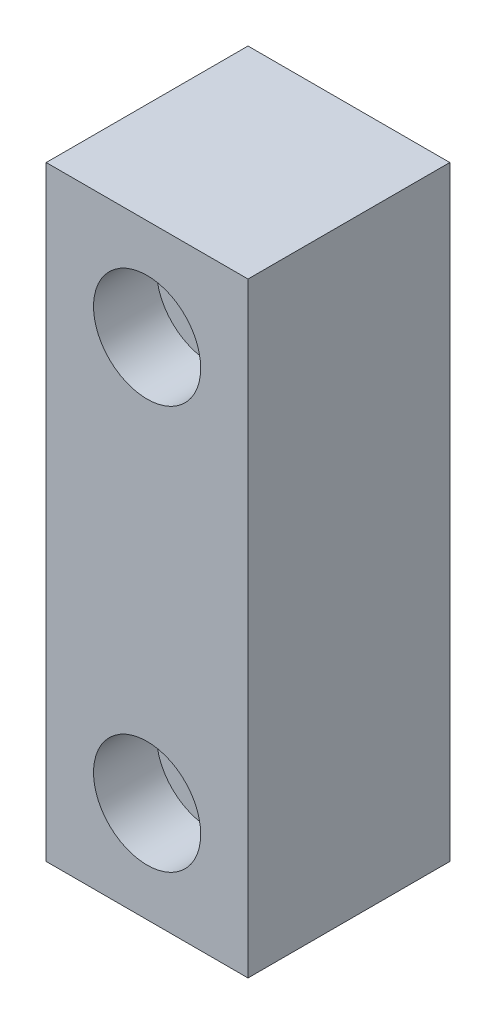
ISO-10303-21;
HEADER;
FILE_DESCRIPTION(('STEP AP214'),'2;1');
FILE_NAME('part.step','',(''),(''),'','','');
FILE_SCHEMA(('AUTOMOTIVE_DESIGN { 1 0 10303 214 1 1 1 1 }'));
ENDSEC;
DATA;
#1=APPLICATION_CONTEXT('core data for automotive mechanical design processes');
#2=APPLICATION_PROTOCOL_DEFINITION('international standard','automotive_design',2000,#1);
#3=PRODUCT_CONTEXT('',#1,'mechanical');
#4=PRODUCT('Part','Part','',(#3));
#5=PRODUCT_RELATED_PRODUCT_CATEGORY('part','',(#4));
#6=PRODUCT_DEFINITION_FORMATION('','',#4);
#7=PRODUCT_DEFINITION_CONTEXT('part definition',#1,'design');
#8=PRODUCT_DEFINITION('design','',#6,#7);
#9=PRODUCT_DEFINITION_SHAPE('','',#8);
#10=(LENGTH_UNIT() NAMED_UNIT(*) SI_UNIT(.MILLI.,.METRE.));
#11=(NAMED_UNIT(*) PLANE_ANGLE_UNIT() SI_UNIT($,.RADIAN.));
#12=(NAMED_UNIT(*) SI_UNIT($,.STERADIAN.) SOLID_ANGLE_UNIT());
#13=UNCERTAINTY_MEASURE_WITH_UNIT(LENGTH_MEASURE(1.E-05),#10,'distance_accuracy_value','');
#14=(GEOMETRIC_REPRESENTATION_CONTEXT(3) GLOBAL_UNCERTAINTY_ASSIGNED_CONTEXT((#13)) GLOBAL_UNIT_ASSIGNED_CONTEXT((#10,
#11,#12)) REPRESENTATION_CONTEXT('',''));
#15=CARTESIAN_POINT('',(0.,0.,0.));
#16=DIRECTION('',(0.,0.,1.));
#17=DIRECTION('',(1.,0.,0.));
#18=AXIS2_PLACEMENT_3D('',#15,#16,#17);
#19=CARTESIAN_POINT('',(12.7,38.1,12.7));
#20=DIRECTION('',(0.,-1.,0.));
#21=DIRECTION('',(0.,0.,-1.));
#22=AXIS2_PLACEMENT_3D('',#19,#20,#21);
#23=PLANE('',#22);
#24=DIRECTION('',(-1.,0.,0.));
#25=VECTOR('',#24,1.);
#26=CARTESIAN_POINT('',(12.7,38.1,-12.7));
#27=LINE('',#26,#25);
#28=CARTESIAN_POINT('',(12.7,38.1,-12.7));
#29=VERTEX_POINT('',#28);
#30=CARTESIAN_POINT('',(-12.7,38.1,-12.7));
#31=VERTEX_POINT('',#30);
#32=EDGE_CURVE('E106',#29,#31,#27,.T.);
#33=ORIENTED_EDGE('',*,*,#32,.T.);
#34=DIRECTION('',(0.,0.,-1.));
#35=VECTOR('',#34,1.);
#36=CARTESIAN_POINT('',(-12.7,38.1,12.7));
#37=LINE('',#36,#35);
#38=CARTESIAN_POINT('',(-12.7,38.1,12.7));
#39=VERTEX_POINT('',#38);
#40=EDGE_CURVE('E11',#39,#31,#37,.T.);
#41=ORIENTED_EDGE('',*,*,#40,.F.);
#42=DIRECTION('',(-1.,0.,0.));
#43=VECTOR('',#42,1.);
#44=CARTESIAN_POINT('',(12.7,38.1,12.7));
#45=LINE('',#44,#43);
#46=CARTESIAN_POINT('',(12.7,38.1,12.7));
#47=VERTEX_POINT('',#46);
#48=EDGE_CURVE('E94',#47,#39,#45,.T.);
#49=ORIENTED_EDGE('',*,*,#48,.F.);
#50=DIRECTION('',(0.,0.,-1.));
#51=VECTOR('',#50,1.);
#52=CARTESIAN_POINT('',(12.7,38.1,12.7));
#53=LINE('',#52,#51);
#54=EDGE_CURVE('E102',#47,#29,#53,.T.);
#55=ORIENTED_EDGE('',*,*,#54,.T.);
#56=EDGE_LOOP('',(#33,#41,#49,#55));
#57=FACE_BOUND('',#56,.T.);
#58=ADVANCED_FACE('F43',(#57),#23,.F.);
#59=CARTESIAN_POINT('',(-12.7,-38.1,12.7));
#60=DIRECTION('',(1.,0.,0.));
#61=DIRECTION('',(0.,0.,-1.));
#62=AXIS2_PLACEMENT_3D('',#59,#60,#61);
#63=PLANE('',#62);
#64=DIRECTION('',(0.,-1.,0.));
#65=VECTOR('',#64,1.);
#66=CARTESIAN_POINT('',(-12.7,-38.1,-12.7));
#67=LINE('',#66,#65);
#68=CARTESIAN_POINT('',(-12.7,-38.1,-12.7));
#69=VERTEX_POINT('',#68);
#70=EDGE_CURVE('E98',#31,#69,#67,.T.);
#71=ORIENTED_EDGE('',*,*,#70,.T.);
#72=DIRECTION('',(0.,0.,-1.));
#73=VECTOR('',#72,1.);
#74=CARTESIAN_POINT('',(-12.7,-38.1,12.7));
#75=LINE('',#74,#73);
#76=CARTESIAN_POINT('',(-12.7,-38.1,12.7));
#77=VERTEX_POINT('',#76);
#78=EDGE_CURVE('E51',#77,#69,#75,.T.);
#79=ORIENTED_EDGE('',*,*,#78,.F.);
#80=DIRECTION('',(0.,-1.,0.));
#81=VECTOR('',#80,1.);
#82=CARTESIAN_POINT('',(-12.7,-38.1,12.7));
#83=LINE('',#82,#81);
#84=EDGE_CURVE('E89',#39,#77,#83,.T.);
#85=ORIENTED_EDGE('',*,*,#84,.F.);
#86=ORIENTED_EDGE('',*,*,#40,.T.);
#87=EDGE_LOOP('',(#71,#79,#85,#86));
#88=FACE_BOUND('',#87,.T.);
#89=ADVANCED_FACE('F97',(#88),#63,.F.);
#90=CARTESIAN_POINT('',(12.7,-38.1,12.7));
#91=DIRECTION('',(0.,1.,0.));
#92=DIRECTION('',(0.,0.,1.));
#93=AXIS2_PLACEMENT_3D('',#90,#91,#92);
#94=PLANE('',#93);
#95=DIRECTION('',(1.,0.,0.));
#96=VECTOR('',#95,1.);
#97=CARTESIAN_POINT('',(12.7,-38.1,-12.7));
#98=LINE('',#97,#96);
#99=CARTESIAN_POINT('',(12.7,-38.1,-12.7));
#100=VERTEX_POINT('',#99);
#101=EDGE_CURVE('E76',#69,#100,#98,.T.);
#102=ORIENTED_EDGE('',*,*,#101,.T.);
#103=DIRECTION('',(0.,0.,-1.));
#104=VECTOR('',#103,1.);
#105=CARTESIAN_POINT('',(12.7,-38.1,12.7));
#106=LINE('',#105,#104);
#107=CARTESIAN_POINT('',(12.7,-38.1,12.7));
#108=VERTEX_POINT('',#107);
#109=EDGE_CURVE('E99',#108,#100,#106,.T.);
#110=ORIENTED_EDGE('',*,*,#109,.F.);
#111=DIRECTION('',(1.,0.,0.));
#112=VECTOR('',#111,1.);
#113=CARTESIAN_POINT('',(12.7,-38.1,12.7));
#114=LINE('',#113,#112);
#115=EDGE_CURVE('E92',#77,#108,#114,.T.);
#116=ORIENTED_EDGE('',*,*,#115,.F.);
#117=ORIENTED_EDGE('',*,*,#78,.T.);
#118=EDGE_LOOP('',(#102,#110,#116,#117));
#119=FACE_BOUND('',#118,.T.);
#120=ADVANCED_FACE('F100',(#119),#94,.F.);
#121=CARTESIAN_POINT('',(12.7,-38.1,12.7));
#122=DIRECTION('',(-1.,0.,0.));
#123=DIRECTION('',(0.,0.,1.));
#124=AXIS2_PLACEMENT_3D('',#121,#122,#123);
#125=PLANE('',#124);
#126=DIRECTION('',(0.,1.,0.));
#127=VECTOR('',#126,1.);
#128=CARTESIAN_POINT('',(12.7,-38.1,-12.7));
#129=LINE('',#128,#127);
#130=EDGE_CURVE('E82',#100,#29,#129,.T.);
#131=ORIENTED_EDGE('',*,*,#130,.T.);
#132=ORIENTED_EDGE('',*,*,#54,.F.);
#133=DIRECTION('',(0.,1.,0.));
#134=VECTOR('',#133,1.);
#135=CARTESIAN_POINT('',(12.7,-38.1,12.7));
#136=LINE('',#135,#134);
#137=EDGE_CURVE('E59',#108,#47,#136,.T.);
#138=ORIENTED_EDGE('',*,*,#137,.F.);
#139=ORIENTED_EDGE('',*,*,#109,.T.);
#140=EDGE_LOOP('',(#131,#132,#138,#139));
#141=FACE_BOUND('',#140,.T.);
#142=ADVANCED_FACE('F114',(#141),#125,.F.);
#143=CARTESIAN_POINT('',(0.,0.,12.7));
#144=DIRECTION('',(0.,0.,-1.));
#145=DIRECTION('',(-1.,0.,0.));
#146=AXIS2_PLACEMENT_3D('',#143,#144,#145);
#147=PLANE('',#146);
#148=CARTESIAN_POINT('',(0.,-25.4,12.7));
#149=DIRECTION('',(0.,0.,1.));
#150=DIRECTION('',(1.,0.,0.));
#151=AXIS2_PLACEMENT_3D('',#148,#149,#150);
#152=CIRCLE('',#151,6.7437);
#153=CARTESIAN_POINT('',(6.7437,-25.4,12.7));
#154=VERTEX_POINT('',#153);
#155=EDGE_CURVE('E140',#154,#154,#152,.T.);
#156=ORIENTED_EDGE('',*,*,#155,.F.);
#157=EDGE_LOOP('',(#156));
#158=FACE_BOUND('',#157,.T.);
#159=CARTESIAN_POINT('',(0.,25.4,12.7));
#160=DIRECTION('',(0.,0.,1.));
#161=DIRECTION('',(1.,0.,0.));
#162=AXIS2_PLACEMENT_3D('',#159,#160,#161);
#163=CIRCLE('',#162,6.7437);
#164=CARTESIAN_POINT('',(6.7437,25.4,12.7));
#165=VERTEX_POINT('',#164);
#166=EDGE_CURVE('E128',#165,#165,#163,.T.);
#167=ORIENTED_EDGE('',*,*,#166,.F.);
#168=EDGE_LOOP('',(#167));
#169=FACE_BOUND('',#168,.T.);
#170=ORIENTED_EDGE('',*,*,#48,.T.);
#171=ORIENTED_EDGE('',*,*,#84,.T.);
#172=ORIENTED_EDGE('',*,*,#115,.T.);
#173=ORIENTED_EDGE('',*,*,#137,.T.);
#174=EDGE_LOOP('',(#170,#171,#172,#173));
#175=FACE_BOUND('',#174,.T.);
#176=ADVANCED_FACE('F90',(#158,#169,#175),#147,.F.);
#177=CARTESIAN_POINT('',(0.,0.,-12.7));
#178=DIRECTION('',(0.,0.,-1.));
#179=DIRECTION('',(-1.,0.,0.));
#180=AXIS2_PLACEMENT_3D('',#177,#178,#179);
#181=PLANE('',#180);
#182=CARTESIAN_POINT('',(0.,-25.4,-12.7));
#183=DIRECTION('',(0.,0.,1.));
#184=DIRECTION('',(1.,0.,0.));
#185=AXIS2_PLACEMENT_3D('',#182,#183,#184);
#186=CIRCLE('',#185,4.36879999999999);
#187=CARTESIAN_POINT('',(4.36879999999999,-25.4,-12.7));
#188=VERTEX_POINT('',#187);
#189=EDGE_CURVE('E131',#188,#188,#186,.T.);
#190=ORIENTED_EDGE('',*,*,#189,.T.);
#191=EDGE_LOOP('',(#190));
#192=FACE_BOUND('',#191,.T.);
#193=CARTESIAN_POINT('',(0.,25.4,-12.7));
#194=DIRECTION('',(0.,0.,1.));
#195=DIRECTION('',(1.,0.,0.));
#196=AXIS2_PLACEMENT_3D('',#193,#194,#195);
#197=CIRCLE('',#196,4.36879999999999);
#198=CARTESIAN_POINT('',(4.36879999999999,25.4,-12.7));
#199=VERTEX_POINT('',#198);
#200=EDGE_CURVE('E109',#199,#199,#197,.T.);
#201=ORIENTED_EDGE('',*,*,#200,.T.);
#202=EDGE_LOOP('',(#201));
#203=FACE_BOUND('',#202,.T.);
#204=ORIENTED_EDGE('',*,*,#32,.F.);
#205=ORIENTED_EDGE('',*,*,#130,.F.);
#206=ORIENTED_EDGE('',*,*,#101,.F.);
#207=ORIENTED_EDGE('',*,*,#70,.F.);
#208=EDGE_LOOP('',(#204,#205,#206,#207));
#209=FACE_BOUND('',#208,.T.);
#210=ADVANCED_FACE('F117',(#192,#203,#209),#181,.T.);
#211=CARTESIAN_POINT('',(0.,25.4,12.7));
#212=DIRECTION('',(0.,0.,1.));
#213=DIRECTION('',(1.,0.,0.));
#214=AXIS2_PLACEMENT_3D('',#211,#212,#213);
#215=CYLINDRICAL_SURFACE('',#214,4.36879999999999);
#216=ORIENTED_EDGE('',*,*,#200,.F.);
#217=EDGE_LOOP('',(#216));
#218=FACE_BOUND('',#217,.T.);
#219=CARTESIAN_POINT('',(0.,25.4,4.77520000000001));
#220=DIRECTION('',(0.,0.,1.));
#221=DIRECTION('',(1.,0.,0.));
#222=AXIS2_PLACEMENT_3D('',#219,#220,#221);
#223=CIRCLE('',#222,4.36879999999999);
#224=CARTESIAN_POINT('',(4.36879999999999,25.4,4.77520000000001));
#225=VERTEX_POINT('',#224);
#226=EDGE_CURVE('E122',#225,#225,#223,.T.);
#227=ORIENTED_EDGE('',*,*,#226,.T.);
#228=EDGE_LOOP('',(#227));
#229=FACE_BOUND('',#228,.T.);
#230=ADVANCED_FACE('F164',(#218,#229),#215,.F.);
#231=CARTESIAN_POINT('',(4.36879999999999,25.4,4.7752));
#232=DIRECTION('',(0.,0.,-1.));
#233=DIRECTION('',(-1.,0.,0.));
#234=AXIS2_PLACEMENT_3D('',#231,#232,#233);
#235=PLANE('',#234);
#236=ORIENTED_EDGE('',*,*,#226,.F.);
#237=EDGE_LOOP('',(#236));
#238=FACE_BOUND('',#237,.T.);
#239=CARTESIAN_POINT('',(0.,25.4,4.7752));
#240=DIRECTION('',(0.,0.,1.));
#241=DIRECTION('',(1.,0.,0.));
#242=AXIS2_PLACEMENT_3D('',#239,#240,#241);
#243=CIRCLE('',#242,6.7437);
#244=CARTESIAN_POINT('',(6.7437,25.4,4.7752));
#245=VERTEX_POINT('',#244);
#246=EDGE_CURVE('E125',#245,#245,#243,.T.);
#247=ORIENTED_EDGE('',*,*,#246,.T.);
#248=EDGE_LOOP('',(#247));
#249=FACE_BOUND('',#248,.T.);
#250=ADVANCED_FACE('F154',(#238,#249),#235,.F.);
#251=CARTESIAN_POINT('',(0.,25.4,12.7));
#252=DIRECTION('',(0.,0.,1.));
#253=DIRECTION('',(1.,0.,0.));
#254=AXIS2_PLACEMENT_3D('',#251,#252,#253);
#255=CYLINDRICAL_SURFACE('',#254,6.7437);
#256=ORIENTED_EDGE('',*,*,#246,.F.);
#257=EDGE_LOOP('',(#256));
#258=FACE_BOUND('',#257,.T.);
#259=ORIENTED_EDGE('',*,*,#166,.T.);
#260=EDGE_LOOP('',(#259));
#261=FACE_BOUND('',#260,.T.);
#262=ADVANCED_FACE('F151',(#258,#261),#255,.F.);
#263=CARTESIAN_POINT('',(0.,-25.4,12.7));
#264=DIRECTION('',(0.,0.,1.));
#265=DIRECTION('',(1.,0.,0.));
#266=AXIS2_PLACEMENT_3D('',#263,#264,#265);
#267=CYLINDRICAL_SURFACE('',#266,4.36879999999999);
#268=ORIENTED_EDGE('',*,*,#189,.F.);
#269=EDGE_LOOP('',(#268));
#270=FACE_BOUND('',#269,.T.);
#271=CARTESIAN_POINT('',(0.,-25.4,4.77520000000001));
#272=DIRECTION('',(0.,0.,1.));
#273=DIRECTION('',(1.,0.,0.));
#274=AXIS2_PLACEMENT_3D('',#271,#272,#273);
#275=CIRCLE('',#274,4.36879999999999);
#276=CARTESIAN_POINT('',(4.36879999999999,-25.4,4.77520000000001));
#277=VERTEX_POINT('',#276);
#278=EDGE_CURVE('E134',#277,#277,#275,.T.);
#279=ORIENTED_EDGE('',*,*,#278,.T.);
#280=EDGE_LOOP('',(#279));
#281=FACE_BOUND('',#280,.T.);
#282=ADVANCED_FACE('F153',(#270,#281),#267,.F.);
#283=CARTESIAN_POINT('',(4.36879999999999,-25.4,4.7752));
#284=DIRECTION('',(0.,0.,-1.));
#285=DIRECTION('',(-1.,0.,0.));
#286=AXIS2_PLACEMENT_3D('',#283,#284,#285);
#287=PLANE('',#286);
#288=ORIENTED_EDGE('',*,*,#278,.F.);
#289=EDGE_LOOP('',(#288));
#290=FACE_BOUND('',#289,.T.);
#291=CARTESIAN_POINT('',(0.,-25.4,4.7752));
#292=DIRECTION('',(0.,0.,1.));
#293=DIRECTION('',(1.,0.,0.));
#294=AXIS2_PLACEMENT_3D('',#291,#292,#293);
#295=CIRCLE('',#294,6.7437);
#296=CARTESIAN_POINT('',(6.7437,-25.4,4.7752));
#297=VERTEX_POINT('',#296);
#298=EDGE_CURVE('E137',#297,#297,#295,.T.);
#299=ORIENTED_EDGE('',*,*,#298,.T.);
#300=EDGE_LOOP('',(#299));
#301=FACE_BOUND('',#300,.T.);
#302=ADVANCED_FACE('F161',(#290,#301),#287,.F.);
#303=CARTESIAN_POINT('',(0.,-25.4,12.7));
#304=DIRECTION('',(0.,0.,1.));
#305=DIRECTION('',(1.,0.,0.));
#306=AXIS2_PLACEMENT_3D('',#303,#304,#305);
#307=CYLINDRICAL_SURFACE('',#306,6.7437);
#308=ORIENTED_EDGE('',*,*,#298,.F.);
#309=EDGE_LOOP('',(#308));
#310=FACE_BOUND('',#309,.T.);
#311=ORIENTED_EDGE('',*,*,#155,.T.);
#312=EDGE_LOOP('',(#311));
#313=FACE_BOUND('',#312,.T.);
#314=ADVANCED_FACE('F144',(#310,#313),#307,.F.);
#315=CLOSED_SHELL('',(#58,#89,#120,#142,#176,#210,#230,#250,#262,#282,#302,#314));
#316=MANIFOLD_SOLID_BREP('B2',#315);
#317=ADVANCED_BREP_SHAPE_REPRESENTATION('',(#18,#316),#14);
#318=SHAPE_DEFINITION_REPRESENTATION(#9,#317);
ENDSEC;
END-ISO-10303-21;
